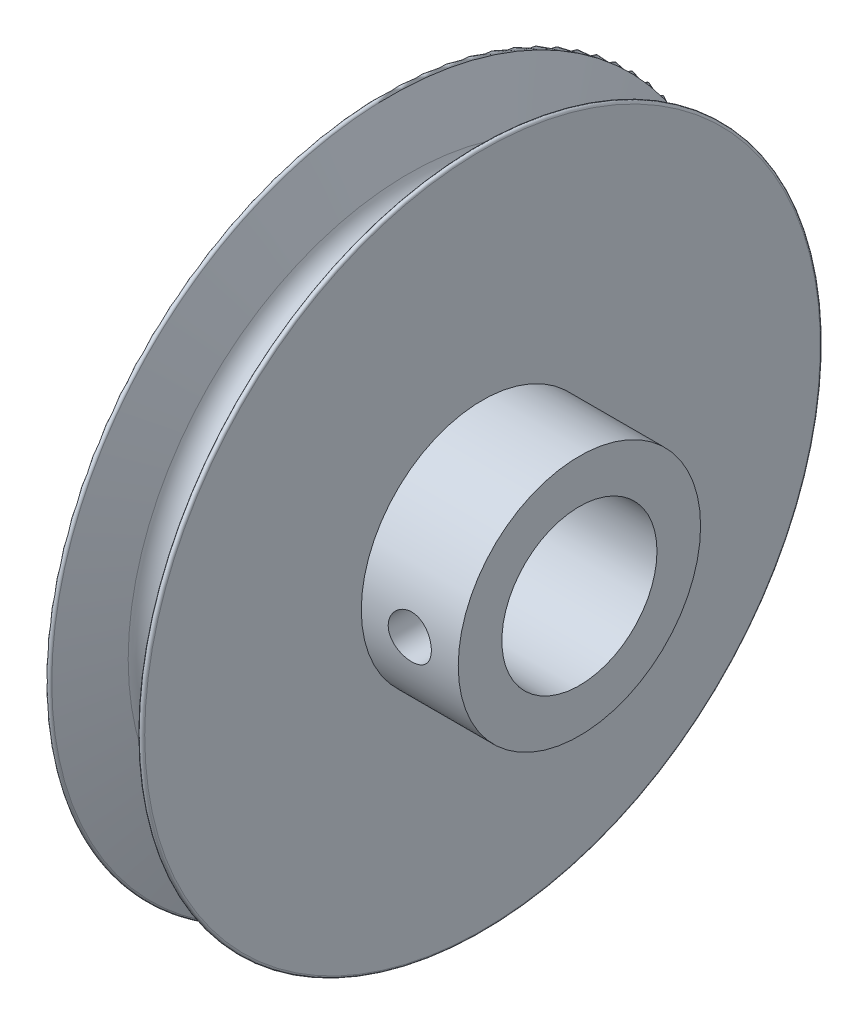
ISO-10303-21;
HEADER;
FILE_DESCRIPTION(('STEP AP214'),'2;1');
FILE_NAME('part.step','',(''),(''),'','','');
FILE_SCHEMA(('AUTOMOTIVE_DESIGN { 1 0 10303 214 1 1 1 1 }'));
ENDSEC;
DATA;
#1=APPLICATION_CONTEXT('core data for automotive mechanical design processes');
#2=APPLICATION_PROTOCOL_DEFINITION('international standard','automotive_design',2000,#1);
#3=PRODUCT_CONTEXT('',#1,'mechanical');
#4=PRODUCT('Part','Part','',(#3));
#5=PRODUCT_RELATED_PRODUCT_CATEGORY('part','',(#4));
#6=PRODUCT_DEFINITION_FORMATION('','',#4);
#7=PRODUCT_DEFINITION_CONTEXT('part definition',#1,'design');
#8=PRODUCT_DEFINITION('design','',#6,#7);
#9=PRODUCT_DEFINITION_SHAPE('','',#8);
#10=(LENGTH_UNIT() NAMED_UNIT(*) SI_UNIT(.MILLI.,.METRE.));
#11=(NAMED_UNIT(*) PLANE_ANGLE_UNIT() SI_UNIT($,.RADIAN.));
#12=(NAMED_UNIT(*) SI_UNIT($,.STERADIAN.) SOLID_ANGLE_UNIT());
#13=UNCERTAINTY_MEASURE_WITH_UNIT(LENGTH_MEASURE(1.E-05),#10,'distance_accuracy_value','');
#14=(GEOMETRIC_REPRESENTATION_CONTEXT(3) GLOBAL_UNCERTAINTY_ASSIGNED_CONTEXT((#13)) GLOBAL_UNIT_ASSIGNED_CONTEXT((#10,
#11,#12)) REPRESENTATION_CONTEXT('',''));
#15=CARTESIAN_POINT('',(0.,0.,0.));
#16=DIRECTION('',(0.,0.,1.));
#17=DIRECTION('',(1.,0.,0.));
#18=AXIS2_PLACEMENT_3D('',#15,#16,#17);
#19=CARTESIAN_POINT('',(0.,0.,0.));
#20=DIRECTION('',(-1.,0.,0.));
#21=DIRECTION('',(0.,0.,1.));
#22=AXIS2_PLACEMENT_3D('',#19,#20,#21);
#23=TOROIDAL_SURFACE('',#22,15.113,1.397);
#24=CARTESIAN_POINT('',(-1.33239884393066,0.,0.));
#25=DIRECTION('',(-1.,0.,0.));
#26=DIRECTION('',(0.,0.,1.));
#27=AXIS2_PLACEMENT_3D('',#24,#25,#26);
#28=CIRCLE('',#27,14.6930924855491);
#29=CARTESIAN_POINT('',(-1.33239884393066,0.,14.6930924855491));
#30=VERTEX_POINT('',#29);
#31=EDGE_CURVE('E60',#30,#30,#28,.T.);
#32=ORIENTED_EDGE('',*,*,#31,.F.);
#33=EDGE_LOOP('',(#32));
#34=FACE_BOUND('',#33,.T.);
#35=CARTESIAN_POINT('',(1.33239884393066,0.,0.));
#36=DIRECTION('',(-1.,0.,0.));
#37=DIRECTION('',(0.,0.,1.));
#38=AXIS2_PLACEMENT_3D('',#35,#36,#37);
#39=CIRCLE('',#38,14.6930924855491);
#40=CARTESIAN_POINT('',(1.33239884393066,0.,14.6930924855491));
#41=VERTEX_POINT('',#40);
#42=EDGE_CURVE('E63',#41,#41,#39,.T.);
#43=ORIENTED_EDGE('',*,*,#42,.T.);
#44=EDGE_LOOP('',(#43));
#45=FACE_BOUND('',#44,.T.);
#46=ADVANCED_FACE('F37',(#34,#45),#23,.F.);
#47=CARTESIAN_POINT('',(-1.90500000000005,0.,0.));
#48=DIRECTION('',(-1.,0.,0.));
#49=DIRECTION('',(0.,0.,1.));
#50=AXIS2_PLACEMENT_3D('',#47,#48,#49);
#51=CONICAL_SURFACE('',#50,16.51,1.26549767000439);
#52=CARTESIAN_POINT('',(-2.29187283236994,0.,0.));
#53=DIRECTION('',(1.,0.,0.));
#54=DIRECTION('',(0.,0.,-1.));
#55=AXIS2_PLACEMENT_3D('',#52,#53,#54);
#56=CIRCLE('',#55,17.7375772565584);
#57=CARTESIAN_POINT('',(-2.29187283236994,0.,-17.7375772565584));
#58=VERTEX_POINT('',#57);
#59=EDGE_CURVE('E52',#58,#58,#56,.T.);
#60=ORIENTED_EDGE('',*,*,#59,.T.);
#61=EDGE_LOOP('',(#60));
#62=FACE_BOUND('',#61,.T.);
#63=ORIENTED_EDGE('',*,*,#31,.T.);
#64=EDGE_LOOP('',(#63));
#65=FACE_BOUND('',#64,.T.);
#66=ADVANCED_FACE('F112',(#62,#65),#51,.T.);
#67=CARTESIAN_POINT('',(-2.54,0.,0.));
#68=DIRECTION('',(1.,0.,0.));
#69=DIRECTION('',(0.,0.,-1.));
#70=AXIS2_PLACEMENT_3D('',#67,#68,#69);
#71=PLANE('',#70);
#72=CARTESIAN_POINT('',(-2.54,0.,0.));
#73=DIRECTION('',(1.,0.,0.));
#74=DIRECTION('',(0.,0.,-1.));
#75=AXIS2_PLACEMENT_3D('',#72,#73,#74);
#76=CIRCLE('',#75,4.064);
#77=CARTESIAN_POINT('',(-2.54,0.,-4.064));
#78=VERTEX_POINT('',#77);
#79=EDGE_CURVE('E69',#78,#78,#76,.T.);
#80=ORIENTED_EDGE('',*,*,#79,.T.);
#81=EDGE_LOOP('',(#80));
#82=FACE_BOUND('',#81,.T.);
#83=CARTESIAN_POINT('',(-2.54,0.,0.));
#84=DIRECTION('',(1.,0.,0.));
#85=DIRECTION('',(0.,0.,-1.));
#86=AXIS2_PLACEMENT_3D('',#83,#84,#85);
#87=CIRCLE('',#86,17.6994038461538);
#88=CARTESIAN_POINT('',(-2.54,0.,-17.6994038461538));
#89=VERTEX_POINT('',#88);
#90=EDGE_CURVE('E57',#89,#89,#87,.F.);
#91=ORIENTED_EDGE('',*,*,#90,.T.);
#92=EDGE_LOOP('',(#91));
#93=FACE_BOUND('',#92,.T.);
#94=ADVANCED_FACE('F118',(#82,#93),#71,.F.);
#95=CARTESIAN_POINT('',(2.54,18.5249038461538,0.));
#96=DIRECTION('',(-1.,0.,0.));
#97=DIRECTION('',(0.,0.,1.));
#98=AXIS2_PLACEMENT_3D('',#95,#96,#97);
#99=PLANE('',#98);
#100=CARTESIAN_POINT('',(2.54,0.,0.));
#101=DIRECTION('',(-1.,0.,0.));
#102=DIRECTION('',(0.,0.,1.));
#103=AXIS2_PLACEMENT_3D('',#100,#101,#102);
#104=CIRCLE('',#103,6.35);
#105=CARTESIAN_POINT('',(2.54,0.,6.35));
#106=VERTEX_POINT('',#105);
#107=EDGE_CURVE('E10',#106,#106,#104,.F.);
#108=ORIENTED_EDGE('',*,*,#107,.F.);
#109=EDGE_LOOP('',(#108));
#110=FACE_BOUND('',#109,.T.);
#111=CARTESIAN_POINT('',(2.54,0.,0.));
#112=DIRECTION('',(-1.,0.,0.));
#113=DIRECTION('',(0.,0.,1.));
#114=AXIS2_PLACEMENT_3D('',#111,#112,#113);
#115=CIRCLE('',#114,17.6994038461537);
#116=CARTESIAN_POINT('',(2.54,0.,17.6994038461537));
#117=VERTEX_POINT('',#116);
#118=EDGE_CURVE('E44',#117,#117,#115,.F.);
#119=ORIENTED_EDGE('',*,*,#118,.T.);
#120=EDGE_LOOP('',(#119));
#121=FACE_BOUND('',#120,.T.);
#122=ADVANCED_FACE('F133',(#110,#121),#99,.F.);
#123=CARTESIAN_POINT('',(1.90500000000005,0.,0.));
#124=DIRECTION('',(1.,0.,0.));
#125=DIRECTION('',(0.,0.,-1.));
#126=AXIS2_PLACEMENT_3D('',#123,#124,#125);
#127=CONICAL_SURFACE('',#126,16.51,1.26549767000436);
#128=CARTESIAN_POINT('',(2.29187283236994,0.,0.));
#129=DIRECTION('',(-1.,0.,0.));
#130=DIRECTION('',(0.,0.,1.));
#131=AXIS2_PLACEMENT_3D('',#128,#129,#130);
#132=CIRCLE('',#131,17.7375772565583);
#133=CARTESIAN_POINT('',(2.29187283236994,0.,17.7375772565583));
#134=VERTEX_POINT('',#133);
#135=EDGE_CURVE('E48',#134,#134,#132,.T.);
#136=ORIENTED_EDGE('',*,*,#135,.T.);
#137=EDGE_LOOP('',(#136));
#138=FACE_BOUND('',#137,.T.);
#139=ORIENTED_EDGE('',*,*,#42,.F.);
#140=EDGE_LOOP('',(#139));
#141=FACE_BOUND('',#140,.T.);
#142=ADVANCED_FACE('F126',(#138,#141),#127,.T.);
#143=CARTESIAN_POINT('',(-2.413,0.,0.));
#144=DIRECTION('',(1.,0.,0.));
#145=DIRECTION('',(0.,0.,-1.));
#146=AXIS2_PLACEMENT_3D('',#143,#144,#145);
#147=TOROIDAL_SURFACE('',#146,17.6994038461538,0.127);
#148=ORIENTED_EDGE('',*,*,#59,.F.);
#149=EDGE_LOOP('',(#148));
#150=FACE_BOUND('',#149,.T.);
#151=ORIENTED_EDGE('',*,*,#90,.F.);
#152=EDGE_LOOP('',(#151));
#153=FACE_BOUND('',#152,.T.);
#154=ADVANCED_FACE('F124',(#150,#153),#147,.T.);
#155=CARTESIAN_POINT('',(2.413,0.,0.));
#156=DIRECTION('',(-1.,0.,0.));
#157=DIRECTION('',(0.,0.,1.));
#158=AXIS2_PLACEMENT_3D('',#155,#156,#157);
#159=TOROIDAL_SURFACE('',#158,17.6994038461537,0.127);
#160=ORIENTED_EDGE('',*,*,#118,.F.);
#161=EDGE_LOOP('',(#160));
#162=FACE_BOUND('',#161,.T.);
#163=ORIENTED_EDGE('',*,*,#135,.F.);
#164=EDGE_LOOP('',(#163));
#165=FACE_BOUND('',#164,.T.);
#166=ADVANCED_FACE('F39',(#162,#165),#159,.T.);
#167=CARTESIAN_POINT('',(7.62,0.,0.));
#168=DIRECTION('',(-1.,0.,0.));
#169=DIRECTION('',(0.,0.,1.));
#170=AXIS2_PLACEMENT_3D('',#167,#168,#169);
#171=CYLINDRICAL_SURFACE('',#170,6.35);
#172=CARTESIAN_POINT('',(6.21029999999999,0.,6.35));
#173=CARTESIAN_POINT('',(6.21029753585875,-0.0629563878791095,6.3499988839214));
#174=CARTESIAN_POINT('',(6.20502233180211,-0.125945518180089,6.34905403128448));
#175=CARTESIAN_POINT('',(6.18407221492296,-0.250152702081869,6.3453758553173));
#176=CARTESIAN_POINT('',(6.16838815534965,-0.31136914852081,6.34264095902063));
#177=CARTESIAN_POINT('',(6.12711256062697,-0.430216353374724,6.33568901554255));
#178=CARTESIAN_POINT('',(6.10152957877459,-0.487850157656379,6.33147324821675));
#179=CARTESIAN_POINT('',(6.04120576041029,-0.598001091171561,6.32202140996736));
#180=CARTESIAN_POINT('',(6.00646580812061,-0.650518713767407,6.31678543757031));
#181=CARTESIAN_POINT('',(5.92841393981999,-0.749522216487122,6.3058088163252));
#182=CARTESIAN_POINT('',(5.88502207301761,-0.795944583557266,6.30006376112309));
#183=CARTESIAN_POINT('',(5.79107015647855,-0.880890742796281,6.28874965760556));
#184=CARTESIAN_POINT('',(5.74050962243936,-0.919414000884793,6.28318062121278));
#185=CARTESIAN_POINT('',(5.63321259733159,-0.987728082473347,6.27280636489557));
#186=CARTESIAN_POINT('',(5.57643490897624,-1.01745513923004,6.26800683286247));
#187=CARTESIAN_POINT('',(5.45859189334214,-1.0669249737415,6.2597766722081));
#188=CARTESIAN_POINT('',(5.39752689824944,-1.08666852406106,6.25634593766797));
#189=CARTESIAN_POINT('',(5.27351937785031,-1.11540879351234,6.2512859511231));
#190=CARTESIAN_POINT('',(5.21060317354828,-1.12451576700911,6.24963823052388));
#191=CARTESIAN_POINT('',(5.08411582736114,-1.13206641649241,6.24827506974414));
#192=CARTESIAN_POINT('',(5.02054473877167,-1.13051095346756,6.24855947354512));
#193=CARTESIAN_POINT('',(4.89534540743307,-1.11687047479473,6.25101158981713));
#194=CARTESIAN_POINT('',(4.83370308285048,-1.10491011333064,6.25315700585985));
#195=CARTESIAN_POINT('',(4.71331418527224,-1.07099533738571,6.25905444840308));
#196=CARTESIAN_POINT('',(4.65456772433695,-1.049040536489,6.26280653702217));
#197=CARTESIAN_POINT('',(4.54126945597339,-0.995636097085759,6.2715182331776));
#198=CARTESIAN_POINT('',(4.48674220667476,-0.964135455052854,6.27648429874685));
#199=CARTESIAN_POINT('',(4.38370031603456,-0.892569656940644,6.28706003112924));
#200=CARTESIAN_POINT('',(4.33518622703208,-0.852503715015034,6.29266975697482));
#201=CARTESIAN_POINT('',(4.24482693538253,-0.764269222158468,6.30399827594321));
#202=CARTESIAN_POINT('',(4.20308598304623,-0.715993892439711,6.30971748810976));
#203=CARTESIAN_POINT('',(4.12828028593166,-0.613070078093335,6.32054731368641));
#204=CARTESIAN_POINT('',(4.09521561263005,-0.558421540967502,6.32565792208253));
#205=CARTESIAN_POINT('',(4.03868847515752,-0.444198884642506,6.33470353710574));
#206=CARTESIAN_POINT('',(4.01523608492227,-0.384619676136645,6.33863730921633));
#207=CARTESIAN_POINT('',(3.97870055907346,-0.262282092255564,6.34487632476616));
#208=CARTESIAN_POINT('',(3.96561643229971,-0.199524021375927,6.34718172386837));
#209=CARTESIAN_POINT('',(3.9503321695874,-0.0735078508517709,6.34988306770141));
#210=CARTESIAN_POINT('',(3.9479890670603,-0.0102676109126005,6.35030409228237));
#211=CARTESIAN_POINT('',(3.95387097116146,0.115701348621398,6.34925825163245));
#212=CARTESIAN_POINT('',(3.96209551176434,0.178430090650149,6.34779146965248));
#213=CARTESIAN_POINT('',(3.9887603424249,0.301147522772469,6.34315039678748));
#214=CARTESIAN_POINT('',(4.00712902410856,0.361152264520321,6.33998807934095));
#215=CARTESIAN_POINT('',(4.05348376972222,0.477230535073566,6.33230904006331));
#216=CARTESIAN_POINT('',(4.08147043502699,0.533303817796236,6.32779223354356));
#217=CARTESIAN_POINT('',(4.14658830006181,0.640542721018922,6.31784277068134));
#218=CARTESIAN_POINT('',(4.18380777470736,0.691653918516031,6.31240144327334));
#219=CARTESIAN_POINT('',(4.266214359984,0.78695626008388,6.30123054524762));
#220=CARTESIAN_POINT('',(4.3114021363805,0.831146825340833,6.29550095057328));
#221=CARTESIAN_POINT('',(4.40910708318684,0.911890524213835,6.28431705815893));
#222=CARTESIAN_POINT('',(4.46170505810055,0.948346537135833,6.27886684675114));
#223=CARTESIAN_POINT('',(4.57236245516387,1.01190558831821,6.26893820466268));
#224=CARTESIAN_POINT('',(4.6304216874095,1.03900895164483,6.2644597402094));
#225=CARTESIAN_POINT('',(4.75009521940192,1.08295206493416,6.25701307344201));
#226=CARTESIAN_POINT('',(4.81169207185482,1.09983812432204,6.25403806705126));
#227=CARTESIAN_POINT('',(4.93690591549276,1.12301156564012,6.24991887731239));
#228=CARTESIAN_POINT('',(5.0005227029798,1.12930001283747,6.24877450994984));
#229=CARTESIAN_POINT('',(5.12699921570332,1.13106684825176,6.24845484979012));
#230=CARTESIAN_POINT('',(5.18985678429464,1.12669827021579,6.24925168135855));
#231=CARTESIAN_POINT('',(5.31392675606409,1.10760816297116,6.25266316282823));
#232=CARTESIAN_POINT('',(5.37513916685103,1.09288668165289,6.25527780432068));
#233=CARTESIAN_POINT('',(5.49410976052446,1.05357047523371,6.26201909575184));
#234=CARTESIAN_POINT('',(5.55187303287971,1.02899073220675,6.26614345047997));
#235=CARTESIAN_POINT('',(5.66248055809407,0.970671955669598,6.27544134328702));
#236=CARTESIAN_POINT('',(5.71532451121157,0.936932364525777,6.28061494523719));
#237=CARTESIAN_POINT('',(5.81536307742797,0.860712930365975,6.29151580295166));
#238=CARTESIAN_POINT('',(5.86247169083399,0.818121129276666,6.29724959616528));
#239=CARTESIAN_POINT('',(5.94892481815668,0.72564113550803,6.30857437800572));
#240=CARTESIAN_POINT('',(5.98826754351142,0.675751266606113,6.31416533347806));
#241=CARTESIAN_POINT('',(6.05836325559861,0.569614887399338,6.32462666894718));
#242=CARTESIAN_POINT('',(6.0890450384979,0.513320736215192,6.32949092933148));
#243=CARTESIAN_POINT('',(6.14046768117397,0.39631076881733,6.33789122140251));
#244=CARTESIAN_POINT('',(6.16121814470906,0.335599289969209,6.34142853555049));
#245=CARTESIAN_POINT('',(6.18783839676948,0.228901192837831,6.34603119498659));
#246=CARTESIAN_POINT('',(6.1962475339284,0.183549007984972,6.34751130526661));
#247=CARTESIAN_POINT('',(6.20747917770765,0.0921370516835596,6.34949610579554));
#248=CARTESIAN_POINT('',(6.21030180348598,0.0460772953483359,6.35000081684933));
#249=CARTESIAN_POINT('',(6.21029999999999,0.,6.35));
#250=B_SPLINE_CURVE_WITH_KNOTS('',3,(#172,#173,#174,#175,#176,#177,#178,#179,#180,#181,#182,
#183,#184,#185,#186,#187,#188,#189,#190,#191,#192,#193,#194,#195,#196,#197,#198,#199,#200,#201,
#202,#203,#204,#205,#206,#207,#208,#209,#210,#211,#212,#213,#214,#215,#216,#217,#218,#219,#220,
#221,#222,#223,#224,#225,#226,#227,#228,#229,#230,#231,#232,#233,#234,#235,#236,#237,#238,#239,
#240,#241,#242,#243,#244,#245,#246,#247,#248,#249),.UNSPECIFIED.,.T.,.F.,(4,2,2,2,2,2,2,2,2,2,2,
2,2,2,2,2,2,2,2,2,2,2,2,2,2,2,2,2,2,2,2,2,2,2,2,2,2,2,4),(0.,0.188700695089458,
0.377567430304385,0.566271335794904,0.754957026188633,0.945474674221974,1.13600519943006,
1.32788488763882,1.51974972513488,1.70960760659306,1.89945015726348,2.08704917225956,
2.27465544102885,2.46328231488539,2.65192650225096,2.84324403808116,3.03456314996839,
3.22608225995456,3.41758305935036,3.6065273740334,3.79546335669533,3.98308236329304,
4.17071310310582,4.36021202617093,4.5497267897079,4.74149628669667,4.93325911775941,
5.1241461524447,5.31501399810742,5.50315717677205,5.69129948513105,5.879156941514,
6.06702583685678,6.25743369109013,6.44788534712722,6.63985995513198,6.83164854337839,
6.96976007448539,7.10786865969789),.UNSPECIFIED.);
#251=CARTESIAN_POINT('',(6.21029999999999,0.,6.35));
#252=VERTEX_POINT('',#251);
#253=EDGE_CURVE('E73',#252,#252,#250,.T.);
#254=ORIENTED_EDGE('',*,*,#253,.T.);
#255=EDGE_LOOP('',(#254));
#256=FACE_BOUND('',#255,.T.);
#257=CARTESIAN_POINT('',(7.62,0.,0.));
#258=DIRECTION('',(1.,0.,0.));
#259=DIRECTION('',(0.,0.,-1.));
#260=AXIS2_PLACEMENT_3D('',#257,#258,#259);
#261=CIRCLE('',#260,6.35);
#262=CARTESIAN_POINT('',(7.62,0.,-6.35));
#263=VERTEX_POINT('',#262);
#264=EDGE_CURVE('E66',#263,#263,#261,.T.);
#265=ORIENTED_EDGE('',*,*,#264,.F.);
#266=EDGE_LOOP('',(#265));
#267=FACE_BOUND('',#266,.T.);
#268=ORIENTED_EDGE('',*,*,#107,.T.);
#269=EDGE_LOOP('',(#268));
#270=FACE_BOUND('',#269,.T.);
#271=ADVANCED_FACE('F88',(#256,#267,#270),#171,.T.);
#272=CARTESIAN_POINT('',(7.62,0.,0.));
#273=DIRECTION('',(1.,0.,0.));
#274=DIRECTION('',(0.,0.,-1.));
#275=AXIS2_PLACEMENT_3D('',#272,#273,#274);
#276=PLANE('',#275);
#277=CARTESIAN_POINT('',(7.62,0.,0.));
#278=DIRECTION('',(1.,0.,0.));
#279=DIRECTION('',(0.,0.,-1.));
#280=AXIS2_PLACEMENT_3D('',#277,#278,#279);
#281=CIRCLE('',#280,4.064);
#282=CARTESIAN_POINT('',(7.62,0.,-4.064));
#283=VERTEX_POINT('',#282);
#284=EDGE_CURVE('E70',#283,#283,#281,.T.);
#285=ORIENTED_EDGE('',*,*,#284,.F.);
#286=EDGE_LOOP('',(#285));
#287=FACE_BOUND('',#286,.T.);
#288=ORIENTED_EDGE('',*,*,#264,.T.);
#289=EDGE_LOOP('',(#288));
#290=FACE_BOUND('',#289,.T.);
#291=ADVANCED_FACE('F101',(#287,#290),#276,.T.);
#292=CARTESIAN_POINT('',(-2.54,0.,0.));
#293=DIRECTION('',(1.,0.,0.));
#294=DIRECTION('',(0.,0.,-1.));
#295=AXIS2_PLACEMENT_3D('',#292,#293,#294);
#296=CYLINDRICAL_SURFACE('',#295,4.064);
#297=CARTESIAN_POINT('',(6.21029999999999,0.,4.064));
#298=CARTESIAN_POINT('',(6.21029874154432,0.06220973825841,4.06399917202932));
#299=CARTESIAN_POINT('',(6.2051469632411,0.124432614216488,4.06255765854052));
#300=CARTESIAN_POINT('',(6.1847165324692,0.247079368176289,4.05694742811095));
#301=CARTESIAN_POINT('',(6.1694336268252,0.307502479477005,4.0527775657844));
#302=CARTESIAN_POINT('',(6.12928115714208,0.424762116690181,4.04216978183844));
#303=CARTESIAN_POINT('',(6.10442455389517,0.481603371153889,4.03573492755621));
#304=CARTESIAN_POINT('',(6.04588004287586,0.590310791630498,4.02127345202224));
#305=CARTESIAN_POINT('',(6.01219134490133,0.642176511917956,4.01324668835897));
#306=CARTESIAN_POINT('',(5.93604897289313,0.740759076993725,3.99623984495569));
#307=CARTESIAN_POINT('',(5.89341497333699,0.787333641116538,3.98724236539539));
#308=CARTESIAN_POINT('',(5.80097729704148,0.872772596694899,3.96941719002472));
#309=CARTESIAN_POINT('',(5.75117261057927,0.911635900472166,3.96058951832423));
#310=CARTESIAN_POINT('',(5.64464914703975,0.981260904055415,3.94392351490019));
#311=CARTESIAN_POINT('',(5.58781750014969,1.01185563117712,3.93610703088888));
#312=CARTESIAN_POINT('',(5.4695640544541,1.06299826881937,3.92260566893746));
#313=CARTESIAN_POINT('',(5.40814318818432,1.08354821408729,3.91692035934488));
#314=CARTESIAN_POINT('',(5.28403818730973,1.11351752064216,3.90850526399603));
#315=CARTESIAN_POINT('',(5.22142148440201,1.12319632963544,3.9057067228596));
#316=CARTESIAN_POINT('',(5.09539535884871,1.13195795297438,3.90317688410482));
#317=CARTESIAN_POINT('',(5.0319861011933,1.13104293716577,3.90344495837681));
#318=CARTESIAN_POINT('',(4.90822724900421,1.11884812752272,3.90695672323829));
#319=CARTESIAN_POINT('',(4.84784336343321,1.10788585277643,3.9101092524872));
#320=CARTESIAN_POINT('',(4.72980774314608,1.0764177265137,3.91888824919575));
#321=CARTESIAN_POINT('',(4.67215624428379,1.05591105279207,3.9245149297896));
#322=CARTESIAN_POINT('',(4.56041127963509,1.00568588265716,3.93768591251238));
#323=CARTESIAN_POINT('',(4.50636934107973,0.975858865267802,3.94525260638554));
#324=CARTESIAN_POINT('',(4.40394777254413,0.907915283670483,3.96143942981919));
#325=CARTESIAN_POINT('',(4.3555693478417,0.869796959867535,3.97005978281863));
#326=CARTESIAN_POINT('',(4.26403817467426,0.784744696857683,3.98775888344504));
#327=CARTESIAN_POINT('',(4.2211329275853,0.737545122731246,3.99684302206039));
#328=CARTESIAN_POINT('',(4.14379370094338,0.636508715747947,4.01417189797732));
#329=CARTESIAN_POINT('',(4.1093601158568,0.58267157400086,4.02241659618151));
#330=CARTESIAN_POINT('',(4.04981928014666,0.469483054272315,4.03719596753552));
#331=CARTESIAN_POINT('',(4.0247601548015,0.410105125766135,4.04372176715051));
#332=CARTESIAN_POINT('',(3.98505313445674,0.287755512230071,4.05426406474072));
#333=CARTESIAN_POINT('',(3.97040275762514,0.224784687751011,4.05828116085632));
#334=CARTESIAN_POINT('',(3.95232544336002,0.0991462789106443,4.06326159055301));
#335=CARTESIAN_POINT('',(3.94856237746795,0.0365306086311021,4.06431635050957));
#336=CARTESIAN_POINT('',(3.95143365174686,-0.0884383367521656,4.06351789903307));
#337=CARTESIAN_POINT('',(3.9580668151285,-0.1507916407531,4.06166501672723));
#338=CARTESIAN_POINT('',(3.9812677169076,-0.27224332098488,4.05531882118972));
#339=CARTESIAN_POINT('',(3.99764501279804,-0.331380969364748,4.05087615636197));
#340=CARTESIAN_POINT('',(4.03964550392105,-0.446061510737907,4.03985725856088));
#341=CARTESIAN_POINT('',(4.06526974304315,-0.501603997037295,4.03328078470981));
#342=CARTESIAN_POINT('',(4.12564033010026,-0.608800813460968,4.01851320906672));
#343=CARTESIAN_POINT('',(4.16056562190482,-0.660350016740804,4.01029131997516));
#344=CARTESIAN_POINT('',(4.23832454068957,-0.756972988532686,3.99318164499096));
#345=CARTESIAN_POINT('',(4.28115987102697,-0.802045358591244,3.98429371591788));
#346=CARTESIAN_POINT('',(4.37509601668104,-0.885873361595803,3.9665122993621));
#347=CARTESIAN_POINT('',(4.42641117107589,-0.924391038720865,3.95762711046998));
#348=CARTESIAN_POINT('',(4.53496712158734,-0.992277519680297,3.94115543106333));
#349=CARTESIAN_POINT('',(4.59220769175036,-1.02164667220382,3.93356889105673));
#350=CARTESIAN_POINT('',(4.71072980297937,-1.07018419227685,3.92064192910347));
#351=CARTESIAN_POINT('',(4.7719867710659,-1.08940907611191,3.91528909830916));
#352=CARTESIAN_POINT('',(4.89704043975281,-1.11723046893102,3.90744226209697));
#353=CARTESIAN_POINT('',(4.96083641534239,-1.12582998981634,3.90494744655104));
#354=CARTESIAN_POINT('',(5.08670959190592,-1.13197239986559,3.90317092239186));
#355=CARTESIAN_POINT('',(5.14876673940363,-1.12989944217272,3.90377757172633));
#356=CARTESIAN_POINT('',(5.27160930382062,-1.1156554282628,3.90787189178129));
#357=CARTESIAN_POINT('',(5.33239475904247,-1.10348467663512,3.91135947560139));
#358=CARTESIAN_POINT('',(5.45043728250613,-1.06962206255164,3.92075334252137));
#359=CARTESIAN_POINT('',(5.50772154599562,-1.04801833568143,3.92663720292704));
#360=CARTESIAN_POINT('',(5.6178970061584,-0.995971187838945,3.94015952953201));
#361=CARTESIAN_POINT('',(5.67078745815246,-0.965526272344663,3.94779829233587));
#362=CARTESIAN_POINT('',(5.77249089940029,-0.895525242899386,3.96427301013081));
#363=CARTESIAN_POINT('',(5.8211207953186,-0.855710232912488,3.97313930596003));
#364=CARTESIAN_POINT('',(5.91113379472026,-0.768582802402663,3.99090841700879));
#365=CARTESIAN_POINT('',(5.95251509754211,-0.721268524491421,3.99981124074188));
#366=CARTESIAN_POINT('',(6.02783283375526,-0.619122456685513,4.01690487850134));
#367=CARTESIAN_POINT('',(6.06156780919789,-0.564138087037643,4.02507360361551));
#368=CARTESIAN_POINT('',(6.11926337208107,-0.449051777722843,4.03952993975987));
#369=CARTESIAN_POINT('',(6.14322968385826,-0.388952860160994,4.04581865188077));
#370=CARTESIAN_POINT('',(6.17790029941534,-0.274308526111783,4.05507925881265));
#371=CARTESIAN_POINT('',(6.1900204724047,-0.220215381666318,4.05839910766481));
#372=CARTESIAN_POINT('',(6.20622040582472,-0.110751527141941,4.06285971751773));
#373=CARTESIAN_POINT('',(6.21030112031487,-0.0553809694454599,4.06400073708426));
#374=CARTESIAN_POINT('',(6.21029999999999,0.,4.064));
#375=B_SPLINE_CURVE_WITH_KNOTS('',3,(#297,#298,#299,#300,#301,#302,#303,#304,#305,#306,#307,
#308,#309,#310,#311,#312,#313,#314,#315,#316,#317,#318,#319,#320,#321,#322,#323,#324,#325,#326,
#327,#328,#329,#330,#331,#332,#333,#334,#335,#336,#337,#338,#339,#340,#341,#342,#343,#344,#345,
#346,#347,#348,#349,#350,#351,#352,#353,#354,#355,#356,#357,#358,#359,#360,#361,#362,#363,#364,
#365,#366,#367,#368,#369,#370,#371,#372,#373,#374),.UNSPECIFIED.,.T.,.F.,(4,2,2,2,2,2,2,2,2,2,2,
2,2,2,2,2,2,2,2,2,2,2,2,2,2,2,2,2,2,2,2,2,2,2,2,2,2,2,4),(0.,0.186426010445106,
0.372930334491679,0.559183053004858,0.745452441125684,0.935917219798429,1.12640884458408,
1.32050016412669,1.51455215074576,1.70386742806307,1.89314393018005,2.07663765130879,
2.26014718248743,2.44587844873016,2.6316491696986,2.82403663668973,3.01643306013274,
3.20980405154789,3.40312892065332,3.59041795793384,3.77768579677584,3.96140858112027,
4.14515211246319,4.33272412606028,4.52033657884322,4.71374075422922,4.90713755725795,
5.0994452075467,5.29169833314397,5.47708081620531,5.66245770760192,5.84613842982147,
6.02985021967778,6.21940268849867,6.40900217848133,6.60313084571281,6.79714559142471,
6.96312729977537,7.12908930954004),.UNSPECIFIED.);
#376=CARTESIAN_POINT('',(6.21029999999999,0.,4.064));
#377=VERTEX_POINT('',#376);
#378=EDGE_CURVE('E83',#377,#377,#375,.T.);
#379=ORIENTED_EDGE('',*,*,#378,.T.);
#380=EDGE_LOOP('',(#379));
#381=FACE_BOUND('',#380,.T.);
#382=ORIENTED_EDGE('',*,*,#79,.F.);
#383=EDGE_LOOP('',(#382));
#384=FACE_BOUND('',#383,.T.);
#385=ORIENTED_EDGE('',*,*,#284,.T.);
#386=EDGE_LOOP('',(#385));
#387=FACE_BOUND('',#386,.T.);
#388=ADVANCED_FACE('F95',(#381,#384,#387),#296,.F.);
#389=CARTESIAN_POINT('',(5.08,0.,6.35));
#390=DIRECTION('',(0.,0.,1.));
#391=DIRECTION('',(1.,0.,0.));
#392=AXIS2_PLACEMENT_3D('',#389,#390,#391);
#393=CYLINDRICAL_SURFACE('',#392,1.13029999999999);
#394=ORIENTED_EDGE('',*,*,#378,.F.);
#395=EDGE_LOOP('',(#394));
#396=FACE_BOUND('',#395,.T.);
#397=ORIENTED_EDGE('',*,*,#253,.F.);
#398=EDGE_LOOP('',(#397));
#399=FACE_BOUND('',#398,.T.);
#400=ADVANCED_FACE('F92',(#396,#399),#393,.F.);
#401=CLOSED_SHELL('',(#46,#66,#94,#122,#142,#154,#166,#271,#291,#388,#400));
#402=MANIFOLD_SOLID_BREP('B2',#401);
#403=ADVANCED_BREP_SHAPE_REPRESENTATION('',(#18,#402),#14);
#404=SHAPE_DEFINITION_REPRESENTATION(#9,#403);
ENDSEC;
END-ISO-10303-21;
